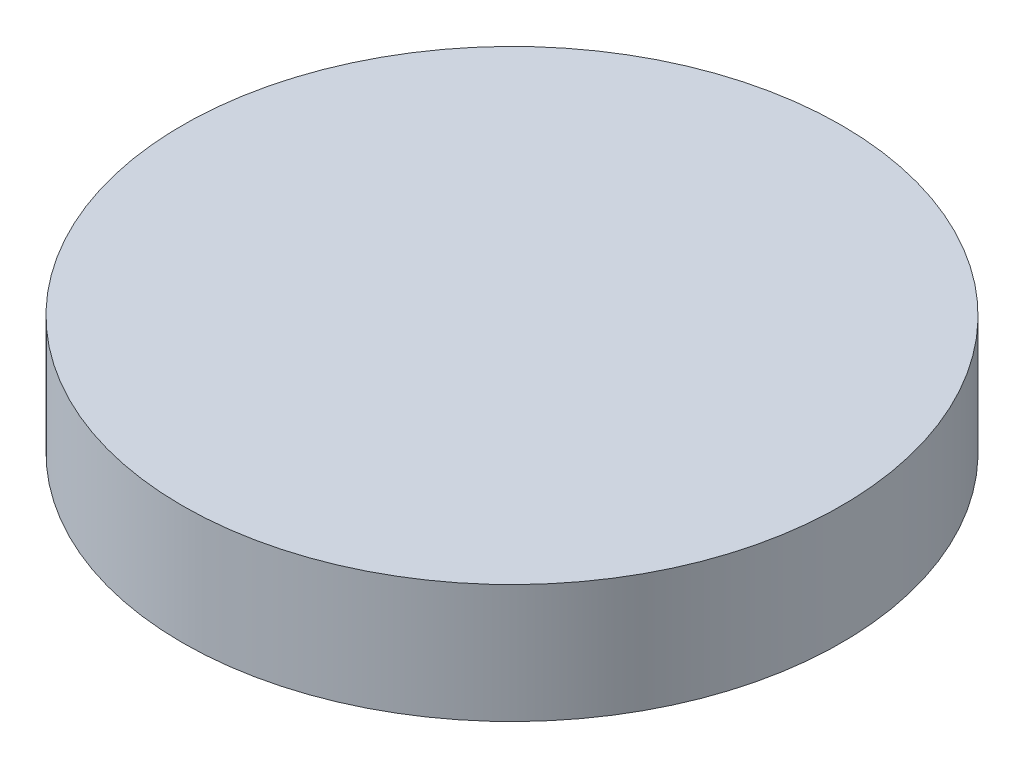
ISO-10303-21;
HEADER;
FILE_DESCRIPTION(('STEP AP214'),'2;1');
FILE_NAME('part.step','',(''),(''),'','','');
FILE_SCHEMA(('AUTOMOTIVE_DESIGN { 1 0 10303 214 1 1 1 1 }'));
ENDSEC;
DATA;
#1=APPLICATION_CONTEXT('core data for automotive mechanical design processes');
#2=APPLICATION_PROTOCOL_DEFINITION('international standard','automotive_design',2000,#1);
#3=PRODUCT_CONTEXT('',#1,'mechanical');
#4=PRODUCT('Part','Part','',(#3));
#5=PRODUCT_RELATED_PRODUCT_CATEGORY('part','',(#4));
#6=PRODUCT_DEFINITION_FORMATION('','',#4);
#7=PRODUCT_DEFINITION_CONTEXT('part definition',#1,'design');
#8=PRODUCT_DEFINITION('design','',#6,#7);
#9=PRODUCT_DEFINITION_SHAPE('','',#8);
#10=(LENGTH_UNIT() NAMED_UNIT(*) SI_UNIT(.MILLI.,.METRE.));
#11=(NAMED_UNIT(*) PLANE_ANGLE_UNIT() SI_UNIT($,.RADIAN.));
#12=(NAMED_UNIT(*) SI_UNIT($,.STERADIAN.) SOLID_ANGLE_UNIT());
#13=UNCERTAINTY_MEASURE_WITH_UNIT(LENGTH_MEASURE(1.E-05),#10,'distance_accuracy_value','');
#14=(GEOMETRIC_REPRESENTATION_CONTEXT(3) GLOBAL_UNCERTAINTY_ASSIGNED_CONTEXT((#13)) GLOBAL_UNIT_ASSIGNED_CONTEXT((#10,
#11,#12)) REPRESENTATION_CONTEXT('',''));
#15=CARTESIAN_POINT('',(0.,0.,0.));
#16=DIRECTION('',(0.,0.,1.));
#17=DIRECTION('',(1.,0.,0.));
#18=AXIS2_PLACEMENT_3D('',#15,#16,#17);
#19=CARTESIAN_POINT('',(0.,4.5,0.));
#20=DIRECTION('',(0.,-1.,0.));
#21=DIRECTION('',(0.,0.,-1.));
#22=AXIS2_PLACEMENT_3D('',#19,#20,#21);
#23=CYLINDRICAL_SURFACE('',#22,12.5);
#24=CARTESIAN_POINT('',(0.,4.5,0.));
#25=DIRECTION('',(0.,1.,0.));
#26=DIRECTION('',(0.,0.,1.));
#27=AXIS2_PLACEMENT_3D('',#24,#25,#26);
#28=CIRCLE('',#27,12.5);
#29=CARTESIAN_POINT('',(0.,4.5,12.5));
#30=VERTEX_POINT('',#29);
#31=EDGE_CURVE('E10',#30,#30,#28,.T.);
#32=ORIENTED_EDGE('',*,*,#31,.F.);
#33=EDGE_LOOP('',(#32));
#34=FACE_BOUND('',#33,.T.);
#35=CARTESIAN_POINT('',(0.,0.,0.));
#36=DIRECTION('',(0.,1.,0.));
#37=DIRECTION('',(0.,0.,1.));
#38=AXIS2_PLACEMENT_3D('',#35,#36,#37);
#39=CIRCLE('',#38,12.5);
#40=CARTESIAN_POINT('',(0.,0.,12.5));
#41=VERTEX_POINT('',#40);
#42=EDGE_CURVE('E40',#41,#41,#39,.T.);
#43=ORIENTED_EDGE('',*,*,#42,.T.);
#44=EDGE_LOOP('',(#43));
#45=FACE_BOUND('',#44,.T.);
#46=ADVANCED_FACE('F37',(#34,#45),#23,.T.);
#47=CARTESIAN_POINT('',(0.,4.5,0.));
#48=DIRECTION('',(0.,1.,0.));
#49=DIRECTION('',(0.,0.,1.));
#50=AXIS2_PLACEMENT_3D('',#47,#48,#49);
#51=PLANE('',#50);
#52=ORIENTED_EDGE('',*,*,#31,.T.);
#53=EDGE_LOOP('',(#52));
#54=FACE_BOUND('',#53,.T.);
#55=ADVANCED_FACE('F52',(#54),#51,.T.);
#56=CARTESIAN_POINT('',(0.,0.,0.));
#57=DIRECTION('',(0.,1.,0.));
#58=DIRECTION('',(0.,0.,1.));
#59=AXIS2_PLACEMENT_3D('',#56,#57,#58);
#60=PLANE('',#59);
#61=ORIENTED_EDGE('',*,*,#42,.F.);
#62=EDGE_LOOP('',(#61));
#63=FACE_BOUND('',#62,.T.);
#64=ADVANCED_FACE('F50',(#63),#60,.F.);
#65=CLOSED_SHELL('',(#46,#55,#64));
#66=MANIFOLD_SOLID_BREP('B2',#65);
#67=ADVANCED_BREP_SHAPE_REPRESENTATION('',(#18,#66),#14);
#68=SHAPE_DEFINITION_REPRESENTATION(#9,#67);
ENDSEC;
END-ISO-10303-21;
